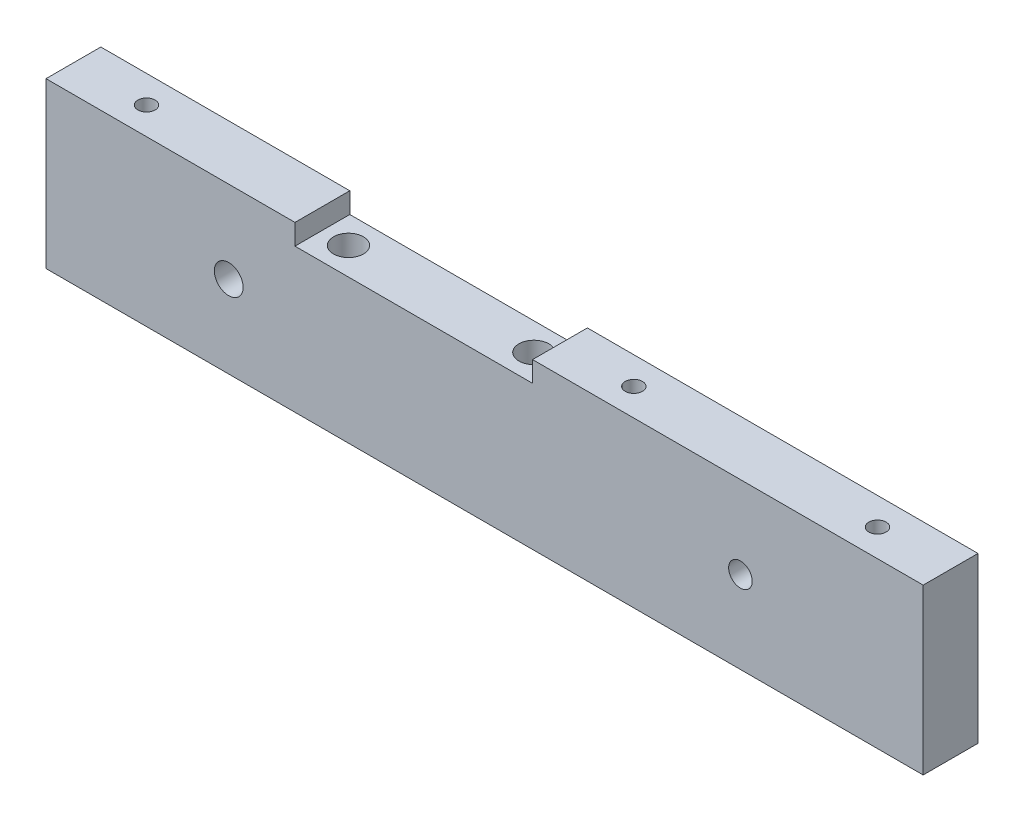
ISO-10303-21;
HEADER;
FILE_DESCRIPTION(('STEP AP214'),'2;1');
FILE_NAME('part.step','',(''),(''),'','','');
FILE_SCHEMA(('AUTOMOTIVE_DESIGN { 1 0 10303 214 1 1 1 1 }'));
ENDSEC;
DATA;
#1=APPLICATION_CONTEXT('core data for automotive mechanical design processes');
#2=APPLICATION_PROTOCOL_DEFINITION('international standard','automotive_design',2000,#1);
#3=PRODUCT_CONTEXT('',#1,'mechanical');
#4=PRODUCT('Part','Part','',(#3));
#5=PRODUCT_RELATED_PRODUCT_CATEGORY('part','',(#4));
#6=PRODUCT_DEFINITION_FORMATION('','',#4);
#7=PRODUCT_DEFINITION_CONTEXT('part definition',#1,'design');
#8=PRODUCT_DEFINITION('design','',#6,#7);
#9=PRODUCT_DEFINITION_SHAPE('','',#8);
#10=(LENGTH_UNIT() NAMED_UNIT(*) SI_UNIT(.MILLI.,.METRE.));
#11=(NAMED_UNIT(*) PLANE_ANGLE_UNIT() SI_UNIT($,.RADIAN.));
#12=(NAMED_UNIT(*) SI_UNIT($,.STERADIAN.) SOLID_ANGLE_UNIT());
#13=UNCERTAINTY_MEASURE_WITH_UNIT(LENGTH_MEASURE(1.E-05),#10,'distance_accuracy_value','');
#14=(GEOMETRIC_REPRESENTATION_CONTEXT(3) GLOBAL_UNCERTAINTY_ASSIGNED_CONTEXT((#13)) GLOBAL_UNIT_ASSIGNED_CONTEXT((#10,
#11,#12)) REPRESENTATION_CONTEXT('',''));
#15=CARTESIAN_POINT('',(0.,0.,0.));
#16=DIRECTION('',(0.,0.,1.));
#17=DIRECTION('',(1.,0.,0.));
#18=AXIS2_PLACEMENT_3D('',#15,#16,#17);
#19=CARTESIAN_POINT('',(124.396126897883,37.6103450415102,59.7256341253695));
#20=DIRECTION('',(0.,-1.,0.));
#21=DIRECTION('',(-1.,0.,0.));
#22=AXIS2_PLACEMENT_3D('',#19,#20,#21);
#23=PLANE('',#22);
#24=CARTESIAN_POINT('',(-15.303873102117,37.6103450415102,64.4881341253694));
#25=DIRECTION('',(0.,-1.,0.));
#26=DIRECTION('',(-1.,0.,0.));
#27=AXIS2_PLACEMENT_3D('',#24,#25,#26);
#28=CIRCLE('',#27,1.49999999999999);
#29=CARTESIAN_POINT('',(-16.803873102117,37.6103450415102,64.4881341253694));
#30=VERTEX_POINT('',#29);
#31=EDGE_CURVE('E59',#30,#30,#28,.T.);
#32=ORIENTED_EDGE('',*,*,#31,.T.);
#33=EDGE_LOOP('',(#32));
#34=FACE_BOUND('',#33,.T.);
#35=DIRECTION('',(0.,0.,-1.));
#36=VECTOR('',#35,1.);
#37=CARTESIAN_POINT('',(15.2511268978829,37.6103450415102,59.7256341253695));
#38=LINE('',#37,#36);
#39=CARTESIAN_POINT('',(15.2511268978829,37.6103450415102,69.2506341253694));
#40=VERTEX_POINT('',#39);
#41=CARTESIAN_POINT('',(15.2511268978829,37.6103450415102,59.7256341253695));
#42=VERTEX_POINT('',#41);
#43=EDGE_CURVE('E202',#40,#42,#38,.T.);
#44=ORIENTED_EDGE('',*,*,#43,.T.);
#45=DIRECTION('',(1.,0.,0.));
#46=VECTOR('',#45,1.);
#47=CARTESIAN_POINT('',(124.396126897883,37.6103450415102,59.7256341253695));
#48=LINE('',#47,#46);
#49=CARTESIAN_POINT('',(-28.0038731021171,37.6103450415102,59.7256341253694));
#50=VERTEX_POINT('',#49);
#51=EDGE_CURVE('E277',#50,#42,#48,.T.);
#52=ORIENTED_EDGE('',*,*,#51,.F.);
#53=DIRECTION('',(0.,0.,1.));
#54=VECTOR('',#53,1.);
#55=CARTESIAN_POINT('',(-28.0038731021171,37.6103450415102,59.7256341253694));
#56=LINE('',#55,#54);
#57=CARTESIAN_POINT('',(-28.0038731021171,37.6103450415102,69.2506341253694));
#58=VERTEX_POINT('',#57);
#59=EDGE_CURVE('E312',#50,#58,#56,.T.);
#60=ORIENTED_EDGE('',*,*,#59,.T.);
#61=DIRECTION('',(1.,0.,0.));
#62=VECTOR('',#61,1.);
#63=CARTESIAN_POINT('',(124.396126897883,37.6103450415102,69.2506341253695));
#64=LINE('',#63,#62);
#65=EDGE_CURVE('E292',#58,#40,#64,.T.);
#66=ORIENTED_EDGE('',*,*,#65,.T.);
#67=EDGE_LOOP('',(#44,#52,#60,#66));
#68=FACE_BOUND('',#67,.T.);
#69=ADVANCED_FACE('F49',(#34,#68),#23,.F.);
#70=CARTESIAN_POINT('',(111.696126897883,37.6103450415102,64.4881341253695));
#71=DIRECTION('',(0.,-1.,0.));
#72=DIRECTION('',(-1.,0.,0.));
#73=AXIS2_PLACEMENT_3D('',#70,#71,#72);
#74=CIRCLE('',#73,1.49999999999999);
#75=CARTESIAN_POINT('',(110.196126897883,37.6103450415102,64.4881341253695));
#76=VERTEX_POINT('',#75);
#77=EDGE_CURVE('E266',#76,#76,#74,.T.);
#78=ORIENTED_EDGE('',*,*,#77,.T.);
#79=EDGE_LOOP('',(#78));
#80=FACE_BOUND('',#79,.T.);
#81=CARTESIAN_POINT('',(69.3627935645496,37.6103450415102,64.4881341253695));
#82=DIRECTION('',(0.,-1.,0.));
#83=DIRECTION('',(-1.,0.,0.));
#84=AXIS2_PLACEMENT_3D('',#81,#82,#83);
#85=CIRCLE('',#84,1.49999999999999);
#86=CARTESIAN_POINT('',(67.8627935645496,37.6103450415102,64.4881341253695));
#87=VERTEX_POINT('',#86);
#88=EDGE_CURVE('E251',#87,#87,#85,.T.);
#89=ORIENTED_EDGE('',*,*,#88,.T.);
#90=EDGE_LOOP('',(#89));
#91=FACE_BOUND('',#90,.T.);
#92=DIRECTION('',(0.,0.,1.));
#93=VECTOR('',#92,1.);
#94=CARTESIAN_POINT('',(56.5311268978829,37.6103450415102,59.7256341253695));
#95=LINE('',#94,#93);
#96=CARTESIAN_POINT('',(56.5311268978829,37.6103450415102,59.7256341253695));
#97=VERTEX_POINT('',#96);
#98=CARTESIAN_POINT('',(56.5311268978829,37.6103450415102,69.2506341253695));
#99=VERTEX_POINT('',#98);
#100=EDGE_CURVE('E184',#97,#99,#95,.T.);
#101=ORIENTED_EDGE('',*,*,#100,.T.);
#102=CARTESIAN_POINT('',(124.396126897883,37.6103450415102,69.2506341253695));
#103=VERTEX_POINT('',#102);
#104=EDGE_CURVE('E291',#99,#103,#64,.T.);
#105=ORIENTED_EDGE('',*,*,#104,.T.);
#106=DIRECTION('',(0.,0.,1.));
#107=VECTOR('',#106,1.);
#108=CARTESIAN_POINT('',(124.396126897883,37.6103450415102,59.7256341253695));
#109=LINE('',#108,#107);
#110=CARTESIAN_POINT('',(124.396126897883,37.6103450415102,59.7256341253695));
#111=VERTEX_POINT('',#110);
#112=EDGE_CURVE('E308',#111,#103,#109,.T.);
#113=ORIENTED_EDGE('',*,*,#112,.F.);
#114=EDGE_CURVE('E275',#97,#111,#48,.T.);
#115=ORIENTED_EDGE('',*,*,#114,.F.);
#116=EDGE_LOOP('',(#101,#105,#113,#115));
#117=FACE_BOUND('',#116,.T.);
#118=ADVANCED_FACE('F342',(#80,#91,#117),#23,.F.);
#119=CARTESIAN_POINT('',(-28.0038731021171,9.03534504151022,59.7256341253695));
#120=DIRECTION('',(0.,0.,1.));
#121=DIRECTION('',(1.,0.,0.));
#122=AXIS2_PLACEMENT_3D('',#119,#120,#121);
#123=PLANE('',#122);
#124=CARTESIAN_POINT('',(92.646126897883,23.3228450415102,59.7256341253695));
#125=DIRECTION('',(0.,0.,-1.));
#126=DIRECTION('',(-1.,0.,0.));
#127=AXIS2_PLACEMENT_3D('',#124,#125,#126);
#128=CIRCLE('',#127,2.05);
#129=CARTESIAN_POINT('',(90.596126897883,23.3228450415102,59.7256341253695));
#130=VERTEX_POINT('',#129);
#131=EDGE_CURVE('E243',#130,#130,#128,.T.);
#132=ORIENTED_EDGE('',*,*,#131,.F.);
#133=EDGE_LOOP('',(#132));
#134=FACE_BOUND('',#133,.T.);
#135=CARTESIAN_POINT('',(3.74612689788295,23.3228450415102,59.7256341253695));
#136=DIRECTION('',(0.,0.,-1.));
#137=DIRECTION('',(-1.,0.,0.));
#138=AXIS2_PLACEMENT_3D('',#135,#136,#137);
#139=CIRCLE('',#138,10.975);
#140=CARTESIAN_POINT('',(-7.22887310211705,23.3228450415102,59.7256341253695));
#141=VERTEX_POINT('',#140);
#142=EDGE_CURVE('E238',#141,#141,#139,.T.);
#143=ORIENTED_EDGE('',*,*,#142,.F.);
#144=EDGE_LOOP('',(#143));
#145=FACE_BOUND('',#144,.T.);
#146=DIRECTION('',(0.,1.,0.));
#147=VECTOR('',#146,1.);
#148=CARTESIAN_POINT('',(15.2511268978829,-33.329310332988,59.7256341253695));
#149=LINE('',#148,#147);
#150=CARTESIAN_POINT('',(15.2511268978829,34.0353450415102,59.7256341253695));
#151=VERTEX_POINT('',#150);
#152=EDGE_CURVE('E210',#151,#42,#149,.T.);
#153=ORIENTED_EDGE('',*,*,#152,.F.);
#154=DIRECTION('',(-1.,0.,0.));
#155=VECTOR('',#154,1.);
#156=CARTESIAN_POINT('',(56.5311268978829,34.0353450415102,59.7256341253695));
#157=LINE('',#156,#155);
#158=CARTESIAN_POINT('',(56.5311268978829,34.0353450415102,59.7256341253695));
#159=VERTEX_POINT('',#158);
#160=EDGE_CURVE('E192',#159,#151,#157,.T.);
#161=ORIENTED_EDGE('',*,*,#160,.F.);
#162=DIRECTION('',(0.,1.,0.));
#163=VECTOR('',#162,1.);
#164=CARTESIAN_POINT('',(56.5311268978829,-33.329310332988,59.7256341253695));
#165=LINE('',#164,#163);
#166=EDGE_CURVE('E206',#159,#97,#165,.T.);
#167=ORIENTED_EDGE('',*,*,#166,.T.);
#168=ORIENTED_EDGE('',*,*,#114,.T.);
#169=DIRECTION('',(0.,-1.,0.));
#170=VECTOR('',#169,1.);
#171=CARTESIAN_POINT('',(124.396126897883,9.03534504151022,59.7256341253695));
#172=LINE('',#171,#170);
#173=CARTESIAN_POINT('',(124.396126897883,9.03534504151022,59.7256341253695));
#174=VERTEX_POINT('',#173);
#175=EDGE_CURVE('E281',#111,#174,#172,.T.);
#176=ORIENTED_EDGE('',*,*,#175,.T.);
#177=DIRECTION('',(-1.,0.,0.));
#178=VECTOR('',#177,1.);
#179=CARTESIAN_POINT('',(-28.0038731021171,9.03534504151022,59.7256341253695));
#180=LINE('',#179,#178);
#181=CARTESIAN_POINT('',(-28.0038731021171,9.03534504151022,59.7256341253695));
#182=VERTEX_POINT('',#181);
#183=EDGE_CURVE('E284',#174,#182,#180,.T.);
#184=ORIENTED_EDGE('',*,*,#183,.T.);
#185=DIRECTION('',(0.,1.,0.));
#186=VECTOR('',#185,1.);
#187=CARTESIAN_POINT('',(-28.0038731021171,37.6103450415102,59.7256341253694));
#188=LINE('',#187,#186);
#189=EDGE_CURVE('E271',#182,#50,#188,.T.);
#190=ORIENTED_EDGE('',*,*,#189,.T.);
#191=ORIENTED_EDGE('',*,*,#51,.T.);
#192=EDGE_LOOP('',(#153,#161,#167,#168,#176,#184,#190,#191));
#193=FACE_BOUND('',#192,.T.);
#194=ADVANCED_FACE('F349',(#134,#145,#193),#123,.F.);
#195=CARTESIAN_POINT('',(-28.0038731021171,9.03534504151023,69.2506341253695));
#196=DIRECTION('',(0.,0.,1.));
#197=DIRECTION('',(1.,0.,0.));
#198=AXIS2_PLACEMENT_3D('',#195,#196,#197);
#199=PLANE('',#198);
#200=CARTESIAN_POINT('',(3.74612689788295,23.3228450415102,69.2506341253695));
#201=DIRECTION('',(0.,0.,-1.));
#202=DIRECTION('',(-1.,0.,0.));
#203=AXIS2_PLACEMENT_3D('',#200,#201,#202);
#204=CIRCLE('',#203,2.5);
#205=CARTESIAN_POINT('',(1.24612689788295,23.3228450415102,69.2506341253695));
#206=VERTEX_POINT('',#205);
#207=EDGE_CURVE('E231',#206,#206,#204,.T.);
#208=ORIENTED_EDGE('',*,*,#207,.T.);
#209=EDGE_LOOP('',(#208));
#210=FACE_BOUND('',#209,.T.);
#211=CARTESIAN_POINT('',(92.646126897883,23.3228450415102,69.2506341253695));
#212=DIRECTION('',(0.,0.,-1.));
#213=DIRECTION('',(-1.,0.,0.));
#214=AXIS2_PLACEMENT_3D('',#211,#212,#213);
#215=CIRCLE('',#214,2.05);
#216=CARTESIAN_POINT('',(90.596126897883,23.3228450415102,69.2506341253695));
#217=VERTEX_POINT('',#216);
#218=EDGE_CURVE('E247',#217,#217,#215,.T.);
#219=ORIENTED_EDGE('',*,*,#218,.T.);
#220=EDGE_LOOP('',(#219));
#221=FACE_BOUND('',#220,.T.);
#222=DIRECTION('',(1.,0.,0.));
#223=VECTOR('',#222,1.);
#224=CARTESIAN_POINT('',(56.5311268978829,34.0353450415102,69.2506341253695));
#225=LINE('',#224,#223);
#226=CARTESIAN_POINT('',(15.2511268978829,34.0353450415102,69.2506341253694));
#227=VERTEX_POINT('',#226);
#228=CARTESIAN_POINT('',(56.5311268978829,34.0353450415102,69.2506341253695));
#229=VERTEX_POINT('',#228);
#230=EDGE_CURVE('E191',#227,#229,#225,.T.);
#231=ORIENTED_EDGE('',*,*,#230,.F.);
#232=DIRECTION('',(0.,1.,0.));
#233=VECTOR('',#232,1.);
#234=CARTESIAN_POINT('',(15.2511268978829,-33.329310332988,69.2506341253695));
#235=LINE('',#234,#233);
#236=EDGE_CURVE('E213',#227,#40,#235,.T.);
#237=ORIENTED_EDGE('',*,*,#236,.T.);
#238=ORIENTED_EDGE('',*,*,#65,.F.);
#239=DIRECTION('',(0.,1.,0.));
#240=VECTOR('',#239,1.);
#241=CARTESIAN_POINT('',(-28.0038731021171,37.6103450415102,69.2506341253694));
#242=LINE('',#241,#240);
#243=CARTESIAN_POINT('',(-28.0038731021171,9.03534504151023,69.2506341253695));
#244=VERTEX_POINT('',#243);
#245=EDGE_CURVE('E270',#244,#58,#242,.T.);
#246=ORIENTED_EDGE('',*,*,#245,.F.);
#247=DIRECTION('',(-1.,0.,0.));
#248=VECTOR('',#247,1.);
#249=CARTESIAN_POINT('',(-28.0038731021171,9.03534504151023,69.2506341253695));
#250=LINE('',#249,#248);
#251=CARTESIAN_POINT('',(124.396126897883,9.03534504151022,69.2506341253695));
#252=VERTEX_POINT('',#251);
#253=EDGE_CURVE('E276',#252,#244,#250,.T.);
#254=ORIENTED_EDGE('',*,*,#253,.F.);
#255=DIRECTION('',(0.,-1.,0.));
#256=VECTOR('',#255,1.);
#257=CARTESIAN_POINT('',(124.396126897883,9.03534504151022,69.2506341253695));
#258=LINE('',#257,#256);
#259=EDGE_CURVE('E296',#103,#252,#258,.T.);
#260=ORIENTED_EDGE('',*,*,#259,.F.);
#261=ORIENTED_EDGE('',*,*,#104,.F.);
#262=DIRECTION('',(0.,1.,0.));
#263=VECTOR('',#262,1.);
#264=CARTESIAN_POINT('',(56.5311268978829,-33.329310332988,69.2506341253695));
#265=LINE('',#264,#263);
#266=EDGE_CURVE('E217',#229,#99,#265,.T.);
#267=ORIENTED_EDGE('',*,*,#266,.F.);
#268=EDGE_LOOP('',(#231,#237,#238,#246,#254,#260,#261,#267));
#269=FACE_BOUND('',#268,.T.);
#270=ADVANCED_FACE('F337',(#210,#221,#269),#199,.T.);
#271=CARTESIAN_POINT('',(19.7861268978829,37.6103450415102,64.4881341253695));
#272=DIRECTION('',(0.,-1.,0.));
#273=DIRECTION('',(-1.,0.,0.));
#274=AXIS2_PLACEMENT_3D('',#271,#272,#273);
#275=CYLINDRICAL_SURFACE('',#274,2.6);
#276=CARTESIAN_POINT('',(19.7861268978829,9.03534504151022,64.4881341253695));
#277=DIRECTION('',(0.,-1.,0.));
#278=DIRECTION('',(-1.,0.,0.));
#279=AXIS2_PLACEMENT_3D('',#276,#277,#278);
#280=CIRCLE('',#279,2.6);
#281=CARTESIAN_POINT('',(17.1861268978829,9.03534504151022,64.4881341253695));
#282=VERTEX_POINT('',#281);
#283=EDGE_CURVE('E226',#282,#282,#280,.T.);
#284=ORIENTED_EDGE('',*,*,#283,.T.);
#285=EDGE_LOOP('',(#284));
#286=FACE_BOUND('',#285,.T.);
#287=CARTESIAN_POINT('',(19.7861268978829,34.0353450415102,64.4881341253695));
#288=DIRECTION('',(0.,1.,0.));
#289=DIRECTION('',(1.,0.,0.));
#290=AXIS2_PLACEMENT_3D('',#287,#288,#289);
#291=CIRCLE('',#290,2.6);
#292=CARTESIAN_POINT('',(22.3861268978829,34.0353450415102,64.4881341253695));
#293=VERTEX_POINT('',#292);
#294=EDGE_CURVE('E222',#293,#293,#291,.F.);
#295=ORIENTED_EDGE('',*,*,#294,.F.);
#296=EDGE_LOOP('',(#295));
#297=FACE_BOUND('',#296,.T.);
#298=ADVANCED_FACE('F327',(#286,#297),#275,.F.);
#299=CARTESIAN_POINT('',(51.9961268978829,37.6103450415102,64.4881341253695));
#300=DIRECTION('',(0.,-1.,0.));
#301=DIRECTION('',(-1.,0.,0.));
#302=AXIS2_PLACEMENT_3D('',#299,#300,#301);
#303=CYLINDRICAL_SURFACE('',#302,2.6);
#304=CARTESIAN_POINT('',(51.9961268978829,9.03534504151022,64.4881341253695));
#305=DIRECTION('',(0.,-1.,0.));
#306=DIRECTION('',(-1.,0.,0.));
#307=AXIS2_PLACEMENT_3D('',#304,#305,#306);
#308=CIRCLE('',#307,2.6);
#309=CARTESIAN_POINT('',(49.3961268978829,9.03534504151022,64.4881341253695));
#310=VERTEX_POINT('',#309);
#311=EDGE_CURVE('E227',#310,#310,#308,.T.);
#312=ORIENTED_EDGE('',*,*,#311,.T.);
#313=EDGE_LOOP('',(#312));
#314=FACE_BOUND('',#313,.T.);
#315=CARTESIAN_POINT('',(51.9961268978829,34.0353450415102,64.4881341253695));
#316=DIRECTION('',(0.,1.,0.));
#317=DIRECTION('',(1.,0.,0.));
#318=AXIS2_PLACEMENT_3D('',#315,#316,#317);
#319=CIRCLE('',#318,2.6);
#320=CARTESIAN_POINT('',(54.596126897883,34.0353450415102,64.4881341253695));
#321=VERTEX_POINT('',#320);
#322=EDGE_CURVE('E198',#321,#321,#319,.F.);
#323=ORIENTED_EDGE('',*,*,#322,.F.);
#324=EDGE_LOOP('',(#323));
#325=FACE_BOUND('',#324,.T.);
#326=ADVANCED_FACE('F325',(#314,#325),#303,.F.);
#327=CARTESIAN_POINT('',(-15.303873102117,9.03534504151022,64.4881341253695));
#328=DIRECTION('',(0.,-1.,0.));
#329=DIRECTION('',(-1.,0.,0.));
#330=AXIS2_PLACEMENT_3D('',#327,#328,#329);
#331=CYLINDRICAL_SURFACE('',#330,1.5);
#332=ORIENTED_EDGE('',*,*,#31,.F.);
#333=EDGE_LOOP('',(#332));
#334=FACE_BOUND('',#333,.T.);
#335=CARTESIAN_POINT('',(-15.303873102117,9.03534504151022,64.4881341253695));
#336=DIRECTION('',(0.,-1.,0.));
#337=DIRECTION('',(-1.,0.,0.));
#338=AXIS2_PLACEMENT_3D('',#335,#336,#337);
#339=CIRCLE('',#338,1.5);
#340=CARTESIAN_POINT('',(-16.803873102117,9.03534504151022,64.4881341253695));
#341=VERTEX_POINT('',#340);
#342=EDGE_CURVE('E12',#341,#341,#339,.T.);
#343=ORIENTED_EDGE('',*,*,#342,.T.);
#344=EDGE_LOOP('',(#343));
#345=FACE_BOUND('',#344,.T.);
#346=ADVANCED_FACE('F51',(#334,#345),#331,.F.);
#347=CARTESIAN_POINT('',(-28.0038731021171,37.6103450415102,59.7256341253694));
#348=DIRECTION('',(1.,0.,0.));
#349=DIRECTION('',(0.,-1.,0.));
#350=AXIS2_PLACEMENT_3D('',#347,#348,#349);
#351=PLANE('',#350);
#352=ORIENTED_EDGE('',*,*,#245,.T.);
#353=ORIENTED_EDGE('',*,*,#59,.F.);
#354=ORIENTED_EDGE('',*,*,#189,.F.);
#355=DIRECTION('',(0.,0.,1.));
#356=VECTOR('',#355,1.);
#357=CARTESIAN_POINT('',(-28.0038731021171,9.03534504151022,59.7256341253695));
#358=LINE('',#357,#356);
#359=EDGE_CURVE('E287',#182,#244,#358,.T.);
#360=ORIENTED_EDGE('',*,*,#359,.T.);
#361=EDGE_LOOP('',(#352,#353,#354,#360));
#362=FACE_BOUND('',#361,.T.);
#363=ADVANCED_FACE('F335',(#362),#351,.F.);
#364=CARTESIAN_POINT('',(124.396126897883,9.03534504151022,59.7256341253695));
#365=DIRECTION('',(-1.,0.,0.));
#366=DIRECTION('',(0.,1.,0.));
#367=AXIS2_PLACEMENT_3D('',#364,#365,#366);
#368=PLANE('',#367);
#369=ORIENTED_EDGE('',*,*,#259,.T.);
#370=DIRECTION('',(0.,0.,1.));
#371=VECTOR('',#370,1.);
#372=CARTESIAN_POINT('',(124.396126897883,9.03534504151022,59.7256341253695));
#373=LINE('',#372,#371);
#374=EDGE_CURVE('E304',#174,#252,#373,.T.);
#375=ORIENTED_EDGE('',*,*,#374,.F.);
#376=ORIENTED_EDGE('',*,*,#175,.F.);
#377=ORIENTED_EDGE('',*,*,#112,.T.);
#378=EDGE_LOOP('',(#369,#375,#376,#377));
#379=FACE_BOUND('',#378,.T.);
#380=ADVANCED_FACE('F353',(#379),#368,.F.);
#381=CARTESIAN_POINT('',(-28.0038731021171,9.03534504151022,59.7256341253695));
#382=DIRECTION('',(0.,1.,0.));
#383=DIRECTION('',(1.,0.,0.));
#384=AXIS2_PLACEMENT_3D('',#381,#382,#383);
#385=PLANE('',#384);
#386=ORIENTED_EDGE('',*,*,#311,.F.);
#387=EDGE_LOOP('',(#386));
#388=FACE_BOUND('',#387,.T.);
#389=ORIENTED_EDGE('',*,*,#283,.F.);
#390=EDGE_LOOP('',(#389));
#391=FACE_BOUND('',#390,.T.);
#392=CARTESIAN_POINT('',(69.3627935645496,9.03534504151022,64.4881341253695));
#393=DIRECTION('',(0.,-1.,0.));
#394=DIRECTION('',(-1.,0.,0.));
#395=AXIS2_PLACEMENT_3D('',#392,#393,#394);
#396=CIRCLE('',#395,1.5);
#397=CARTESIAN_POINT('',(67.8627935645496,9.03534504151022,64.4881341253695));
#398=VERTEX_POINT('',#397);
#399=EDGE_CURVE('E258',#398,#398,#396,.T.);
#400=ORIENTED_EDGE('',*,*,#399,.F.);
#401=EDGE_LOOP('',(#400));
#402=FACE_BOUND('',#401,.T.);
#403=CARTESIAN_POINT('',(111.696126897883,9.03534504151022,64.4881341253695));
#404=DIRECTION('',(0.,-1.,0.));
#405=DIRECTION('',(-1.,0.,0.));
#406=AXIS2_PLACEMENT_3D('',#403,#404,#405);
#407=CIRCLE('',#406,1.5);
#408=CARTESIAN_POINT('',(110.196126897883,9.03534504151022,64.4881341253695));
#409=VERTEX_POINT('',#408);
#410=EDGE_CURVE('E262',#409,#409,#407,.T.);
#411=ORIENTED_EDGE('',*,*,#410,.F.);
#412=EDGE_LOOP('',(#411));
#413=FACE_BOUND('',#412,.T.);
#414=ORIENTED_EDGE('',*,*,#253,.T.);
#415=ORIENTED_EDGE('',*,*,#359,.F.);
#416=ORIENTED_EDGE('',*,*,#183,.F.);
#417=ORIENTED_EDGE('',*,*,#374,.T.);
#418=EDGE_LOOP('',(#414,#415,#416,#417));
#419=FACE_BOUND('',#418,.T.);
#420=ORIENTED_EDGE('',*,*,#342,.F.);
#421=EDGE_LOOP('',(#420));
#422=FACE_BOUND('',#421,.T.);
#423=ADVANCED_FACE('F358',(#388,#391,#402,#413,#419,#422),#385,.F.);
#424=CARTESIAN_POINT('',(111.696126897883,9.03534504151022,64.4881341253695));
#425=DIRECTION('',(0.,-1.,0.));
#426=DIRECTION('',(-1.,0.,0.));
#427=AXIS2_PLACEMENT_3D('',#424,#425,#426);
#428=CYLINDRICAL_SURFACE('',#427,1.5);
#429=ORIENTED_EDGE('',*,*,#77,.F.);
#430=EDGE_LOOP('',(#429));
#431=FACE_BOUND('',#430,.T.);
#432=ORIENTED_EDGE('',*,*,#410,.T.);
#433=EDGE_LOOP('',(#432));
#434=FACE_BOUND('',#433,.T.);
#435=ADVANCED_FACE('F507',(#431,#434),#428,.F.);
#436=CARTESIAN_POINT('',(69.3627935645496,9.03534504151022,64.4881341253695));
#437=DIRECTION('',(0.,-1.,0.));
#438=DIRECTION('',(-1.,0.,0.));
#439=AXIS2_PLACEMENT_3D('',#436,#437,#438);
#440=CYLINDRICAL_SURFACE('',#439,1.5);
#441=ORIENTED_EDGE('',*,*,#88,.F.);
#442=EDGE_LOOP('',(#441));
#443=FACE_BOUND('',#442,.T.);
#444=ORIENTED_EDGE('',*,*,#399,.T.);
#445=EDGE_LOOP('',(#444));
#446=FACE_BOUND('',#445,.T.);
#447=ADVANCED_FACE('F502',(#443,#446),#440,.F.);
#448=CARTESIAN_POINT('',(92.646126897883,23.3228450415102,69.2506341253695));
#449=DIRECTION('',(0.,0.,-1.));
#450=DIRECTION('',(-1.,0.,0.));
#451=AXIS2_PLACEMENT_3D('',#448,#449,#450);
#452=CYLINDRICAL_SURFACE('',#451,2.05);
#453=CARTESIAN_POINT('',(90.596126897883,23.3228450415102,69.2506341253695));
#454=CARTESIAN_POINT('',(90.596126897883,23.3228450415102,69.1514153753695));
#455=CARTESIAN_POINT('',(90.596126897883,23.3228450415102,69.0521966253695));
#456=CARTESIAN_POINT('',(90.596126897883,23.3228450415102,68.8537591253695));
#457=CARTESIAN_POINT('',(90.596126897883,23.3228450415102,68.7545403753695));
#458=CARTESIAN_POINT('',(90.596126897883,23.3228450415102,68.5561028753695));
#459=CARTESIAN_POINT('',(90.596126897883,23.3228450415102,68.4568841253695));
#460=CARTESIAN_POINT('',(90.596126897883,23.3228450415102,68.2584466253695));
#461=CARTESIAN_POINT('',(90.596126897883,23.3228450415102,68.1592278753695));
#462=CARTESIAN_POINT('',(90.596126897883,23.3228450415102,67.9607903753695));
#463=CARTESIAN_POINT('',(90.596126897883,23.3228450415102,67.8615716253695));
#464=CARTESIAN_POINT('',(90.596126897883,23.3228450415102,67.6631341253695));
#465=CARTESIAN_POINT('',(90.596126897883,23.3228450415102,67.5639153753695));
#466=CARTESIAN_POINT('',(90.596126897883,23.3228450415102,67.3654778753695));
#467=CARTESIAN_POINT('',(90.596126897883,23.3228450415102,67.2662591253695));
#468=CARTESIAN_POINT('',(90.596126897883,23.3228450415102,67.0678216253695));
#469=CARTESIAN_POINT('',(90.596126897883,23.3228450415102,66.9686028753695));
#470=CARTESIAN_POINT('',(90.596126897883,23.3228450415102,66.7701653753695));
#471=CARTESIAN_POINT('',(90.596126897883,23.3228450415102,66.6709466253695));
#472=CARTESIAN_POINT('',(90.596126897883,23.3228450415102,66.4725091253695));
#473=CARTESIAN_POINT('',(90.596126897883,23.3228450415102,66.3732903753695));
#474=CARTESIAN_POINT('',(90.596126897883,23.3228450415102,66.1748528753695));
#475=CARTESIAN_POINT('',(90.596126897883,23.3228450415102,66.0756341253695));
#476=CARTESIAN_POINT('',(90.596126897883,23.3228450415102,65.8771966253695));
#477=CARTESIAN_POINT('',(90.596126897883,23.3228450415102,65.7779778753695));
#478=CARTESIAN_POINT('',(90.596126897883,23.3228450415102,65.5795403753695));
#479=CARTESIAN_POINT('',(90.596126897883,23.3228450415102,65.4803216253695));
#480=CARTESIAN_POINT('',(90.596126897883,23.3228450415102,65.2818841253695));
#481=CARTESIAN_POINT('',(90.596126897883,23.3228450415102,65.1826653753695));
#482=CARTESIAN_POINT('',(90.596126897883,23.3228450415102,64.9842278753695));
#483=CARTESIAN_POINT('',(90.596126897883,23.3228450415102,64.8850091253695));
#484=CARTESIAN_POINT('',(90.596126897883,23.3228450415102,64.6865716253695));
#485=CARTESIAN_POINT('',(90.596126897883,23.3228450415102,64.5873528753695));
#486=CARTESIAN_POINT('',(90.596126897883,23.3228450415102,64.3889153753695));
#487=CARTESIAN_POINT('',(90.596126897883,23.3228450415102,64.2896966253695));
#488=CARTESIAN_POINT('',(90.596126897883,23.3228450415102,64.0912591253695));
#489=CARTESIAN_POINT('',(90.596126897883,23.3228450415102,63.9920403753695));
#490=CARTESIAN_POINT('',(90.596126897883,23.3228450415102,63.7936028753695));
#491=CARTESIAN_POINT('',(90.596126897883,23.3228450415102,63.6943841253695));
#492=CARTESIAN_POINT('',(90.596126897883,23.3228450415102,63.4959466253695));
#493=CARTESIAN_POINT('',(90.596126897883,23.3228450415102,63.3967278753695));
#494=CARTESIAN_POINT('',(90.596126897883,23.3228450415102,63.1982903753695));
#495=CARTESIAN_POINT('',(90.596126897883,23.3228450415102,63.0990716253695));
#496=CARTESIAN_POINT('',(90.596126897883,23.3228450415102,62.9006341253695));
#497=CARTESIAN_POINT('',(90.596126897883,23.3228450415102,62.8014153753695));
#498=CARTESIAN_POINT('',(90.596126897883,23.3228450415102,62.6029778753695));
#499=CARTESIAN_POINT('',(90.596126897883,23.3228450415102,62.5037591253695));
#500=CARTESIAN_POINT('',(90.596126897883,23.3228450415102,62.3053216253695));
#501=CARTESIAN_POINT('',(90.596126897883,23.3228450415102,62.2061028753695));
#502=CARTESIAN_POINT('',(90.596126897883,23.3228450415102,62.0076653753695));
#503=CARTESIAN_POINT('',(90.596126897883,23.3228450415102,61.9084466253695));
#504=CARTESIAN_POINT('',(90.596126897883,23.3228450415102,61.7100091253695));
#505=CARTESIAN_POINT('',(90.596126897883,23.3228450415102,61.6107903753695));
#506=CARTESIAN_POINT('',(90.596126897883,23.3228450415102,61.4123528753695));
#507=CARTESIAN_POINT('',(90.596126897883,23.3228450415102,61.3131341253695));
#508=CARTESIAN_POINT('',(90.596126897883,23.3228450415102,61.1146966253695));
#509=CARTESIAN_POINT('',(90.596126897883,23.3228450415102,61.0154778753695));
#510=CARTESIAN_POINT('',(90.596126897883,23.3228450415102,60.8170403753695));
#511=CARTESIAN_POINT('',(90.596126897883,23.3228450415102,60.7178216253695));
#512=CARTESIAN_POINT('',(90.596126897883,23.3228450415102,60.5193841253695));
#513=CARTESIAN_POINT('',(90.596126897883,23.3228450415102,60.4201653753695));
#514=CARTESIAN_POINT('',(90.596126897883,23.3228450415102,60.2217278753695));
#515=CARTESIAN_POINT('',(90.596126897883,23.3228450415102,60.1225091253695));
#516=CARTESIAN_POINT('',(90.596126897883,23.3228450415102,59.9240716253695));
#517=CARTESIAN_POINT('',(90.596126897883,23.3228450415102,59.8248528753695));
#518=CARTESIAN_POINT('',(90.596126897883,23.3228450415102,59.7256341253695));
#519=B_SPLINE_CURVE_WITH_KNOTS('',3,(#453,#454,#455,#456,#457,#458,#459,#460,#461,#462,#463,
#464,#465,#466,#467,#468,#469,#470,#471,#472,#473,#474,#475,#476,#477,#478,#479,#480,#481,#482,
#483,#484,#485,#486,#487,#488,#489,#490,#491,#492,#493,#494,#495,#496,#497,#498,#499,#500,#501,
#502,#503,#504,#505,#506,#507,#508,#509,#510,#511,#512,#513,#514,#515,#516,#517,#518),
.UNSPECIFIED.,.F.,.F.,(4,2,2,2,2,2,2,2,2,2,2,2,2,2,2,2,2,2,2,2,2,2,2,2,2,2,2,2,2,2,2,2,4),(0.,
0.297656249999986,0.595312499999986,0.892968749999987,1.19062499999999,1.48828124999999,
1.78593749999999,2.08359374999999,2.38124999999999,2.67890624999999,2.97656249999999,
3.27421874999999,3.57187499999999,3.86953124999999,4.16718749999999,4.46484374999999,
4.76249999999999,5.06015624999999,5.35781249999999,5.65546874999999,5.95312499999999,
6.25078124999999,6.54843749999999,6.84609374999999,7.14374999999999,7.44140624999999,
7.73906249999999,8.03671874999999,8.33437499999999,8.63203124999999,8.92968749999998,
9.22734374999999,9.52499999999998),.UNSPECIFIED.);
#520=EDGE_CURVE('BSEAM506',#217,#130,#519,.T.);
#521=ORIENTED_EDGE('',*,*,#218,.F.);
#522=ORIENTED_EDGE('',*,*,#131,.T.);
#523=ORIENTED_EDGE('',*,*,#520,.T.);
#524=ORIENTED_EDGE('',*,*,#520,.F.);
#525=EDGE_LOOP('',(#521,#523,#522,#524));
#526=FACE_BOUND('',#525,.T.);
#527=ADVANCED_FACE('F506',(#526),#452,.F.);
#528=CARTESIAN_POINT('',(3.74612689788295,23.3228450415102,63.7256341253695));
#529=DIRECTION('',(0.,0.,-1.));
#530=DIRECTION('',(-1.,0.,0.));
#531=AXIS2_PLACEMENT_3D('',#528,#529,#530);
#532=CYLINDRICAL_SURFACE('',#531,10.975);
#533=CARTESIAN_POINT('',(3.74612689788295,23.3228450415102,63.7256341253695));
#534=DIRECTION('',(0.,0.,-1.));
#535=DIRECTION('',(-1.,0.,0.));
#536=AXIS2_PLACEMENT_3D('',#533,#534,#535);
#537=CIRCLE('',#536,10.975);
#538=CARTESIAN_POINT('',(-7.22887310211705,23.3228450415102,63.7256341253695));
#539=VERTEX_POINT('',#538);
#540=EDGE_CURVE('E239',#539,#539,#537,.T.);
#541=ORIENTED_EDGE('',*,*,#540,.F.);
#542=EDGE_LOOP('',(#541));
#543=FACE_BOUND('',#542,.T.);
#544=ORIENTED_EDGE('',*,*,#142,.T.);
#545=EDGE_LOOP('',(#544));
#546=FACE_BOUND('',#545,.T.);
#547=ADVANCED_FACE('F517',(#543,#546),#532,.F.);
#548=CARTESIAN_POINT('',(3.74612689788295,23.3228450415102,63.7256341253695));
#549=DIRECTION('',(0.,0.,-1.));
#550=DIRECTION('',(-1.,0.,0.));
#551=AXIS2_PLACEMENT_3D('',#548,#549,#550);
#552=PLANE('',#551);
#553=CARTESIAN_POINT('',(3.74612689788244,23.3228450415107,63.7256341253695));
#554=DIRECTION('',(0.,0.,1.));
#555=DIRECTION('',(0.,-1.,0.));
#556=AXIS2_PLACEMENT_3D('',#553,#554,#555);
#557=CIRCLE('',#556,7.05000000000037);
#558=CARTESIAN_POINT('',(2.08227128391115,16.4719995100554,63.7256341253695));
#559=VERTEX_POINT('',#558);
#560=CARTESIAN_POINT('',(10.5969724293378,24.986700655482,63.7256341253695));
#561=VERTEX_POINT('',#560);
#562=EDGE_CURVE('E173',#559,#561,#557,.T.);
#563=ORIENTED_EDGE('',*,*,#562,.T.);
#564=DIRECTION('',(-0.70424609220261,0.709955943434065,0.));
#565=VECTOR('',#564,1.);
#566=CARTESIAN_POINT('',(10.5969724293378,24.986700655482,63.7256341253695));
#567=LINE('',#566,#565);
#568=CARTESIAN_POINT('',(5.50420229039073,30.1207617013597,63.7256341253695));
#569=VERTEX_POINT('',#568);
#570=EDGE_CURVE('E67',#561,#569,#567,.T.);
#571=ORIENTED_EDGE('',*,*,#570,.T.);
#572=CARTESIAN_POINT('',(3.72360911328465,23.3226019660952,63.7256341253695));
#573=DIRECTION('',(0.,0.,1.));
#574=DIRECTION('',(0.,-1.,0.));
#575=AXIS2_PLACEMENT_3D('',#572,#573,#574);
#576=CIRCLE('',#575,7.02748090346233);
#577=CARTESIAN_POINT('',(-3.10044007129684,21.6439594863097,63.7256341253695));
#578=VERTEX_POINT('',#577);
#579=EDGE_CURVE('E177',#569,#578,#576,.T.);
#580=ORIENTED_EDGE('',*,*,#579,.T.);
#581=CARTESIAN_POINT('',(-2.91039067333845,21.7061773251248,63.7256341253695));
#582=DIRECTION('',(0.,0.,1.));
#583=DIRECTION('',(0.,-1.,0.));
#584=AXIS2_PLACEMENT_3D('',#581,#582,#583);
#585=CIRCLE('',#584,0.199974581212627);
#586=CARTESIAN_POINT('',(-3.0517897619665,21.5647696490024,63.7256341253695));
#587=VERTEX_POINT('',#586);
#588=EDGE_CURVE('E643',#578,#587,#585,.T.);
#589=ORIENTED_EDGE('',*,*,#588,.T.);
#590=DIRECTION('',(0.707128252325196,-0.707085309395913,0.));
#591=VECTOR('',#590,1.);
#592=CARTESIAN_POINT('',(-3.0517897619665,21.5647696490024,63.7256341253695));
#593=LINE('',#592,#591);
#594=CARTESIAN_POINT('',(1.99478639413294,16.518499964554,63.7256341253695));
#595=VERTEX_POINT('',#594);
#596=EDGE_CURVE('E626',#587,#595,#593,.T.);
#597=ORIENTED_EDGE('',*,*,#596,.T.);
#598=CARTESIAN_POINT('',(2.12947286161245,16.666349737898,63.7256341253695));
#599=DIRECTION('',(0.,0.,1.));
#600=DIRECTION('',(0.,-1.,0.));
#601=AXIS2_PLACEMENT_3D('',#598,#599,#600);
#602=CIRCLE('',#601,0.199999999999948);
#603=EDGE_CURVE('E621',#595,#559,#602,.T.);
#604=ORIENTED_EDGE('',*,*,#603,.T.);
#605=EDGE_LOOP('',(#563,#571,#580,#589,#597,#604));
#606=FACE_BOUND('',#605,.T.);
#607=ORIENTED_EDGE('',*,*,#540,.T.);
#608=EDGE_LOOP('',(#607));
#609=FACE_BOUND('',#608,.T.);
#610=ADVANCED_FACE('F397',(#606,#609),#552,.T.);
#611=CARTESIAN_POINT('',(3.74612689788295,23.3228450415102,69.2506341253695));
#612=DIRECTION('',(0.,0.,-1.));
#613=DIRECTION('',(-1.,0.,0.));
#614=AXIS2_PLACEMENT_3D('',#611,#612,#613);
#615=CYLINDRICAL_SURFACE('',#614,2.5);
#616=CARTESIAN_POINT('',(3.74612689788295,23.3228450415102,65.5256341253695));
#617=DIRECTION('',(0.,0.,1.));
#618=DIRECTION('',(0.,-1.,0.));
#619=AXIS2_PLACEMENT_3D('',#616,#617,#618);
#620=CIRCLE('',#619,2.5);
#621=CARTESIAN_POINT('',(3.74612689788295,20.8228450415102,65.5256341253695));
#622=VERTEX_POINT('',#621);
#623=EDGE_CURVE('E53',#622,#622,#620,.F.);
#624=ORIENTED_EDGE('',*,*,#623,.T.);
#625=EDGE_LOOP('',(#624));
#626=FACE_BOUND('',#625,.T.);
#627=ORIENTED_EDGE('',*,*,#207,.F.);
#628=EDGE_LOOP('',(#627));
#629=FACE_BOUND('',#628,.T.);
#630=ADVANCED_FACE('F388',(#626,#629),#615,.F.);
#631=CARTESIAN_POINT('',(-28.0038731021171,34.0353450415102,59.7256341253694));
#632=DIRECTION('',(0.,1.,0.));
#633=DIRECTION('',(1.,0.,0.));
#634=AXIS2_PLACEMENT_3D('',#631,#632,#633);
#635=PLANE('',#634);
#636=ORIENTED_EDGE('',*,*,#230,.T.);
#637=DIRECTION('',(0.,0.,-1.));
#638=VECTOR('',#637,1.);
#639=CARTESIAN_POINT('',(56.5311268978829,34.0353450415102,59.7256341253695));
#640=LINE('',#639,#638);
#641=EDGE_CURVE('E195',#229,#159,#640,.T.);
#642=ORIENTED_EDGE('',*,*,#641,.T.);
#643=ORIENTED_EDGE('',*,*,#160,.T.);
#644=DIRECTION('',(0.,0.,1.));
#645=VECTOR('',#644,1.);
#646=CARTESIAN_POINT('',(15.2511268978829,34.0353450415102,59.7256341253695));
#647=LINE('',#646,#645);
#648=EDGE_CURVE('E75',#151,#227,#647,.T.);
#649=ORIENTED_EDGE('',*,*,#648,.T.);
#650=EDGE_LOOP('',(#636,#642,#643,#649));
#651=FACE_BOUND('',#650,.T.);
#652=ORIENTED_EDGE('',*,*,#322,.T.);
#653=EDGE_LOOP('',(#652));
#654=FACE_BOUND('',#653,.T.);
#655=ORIENTED_EDGE('',*,*,#294,.T.);
#656=EDGE_LOOP('',(#655));
#657=FACE_BOUND('',#656,.T.);
#658=ADVANCED_FACE('F322',(#651,#654,#657),#635,.T.);
#659=CARTESIAN_POINT('',(15.2511268978829,-33.329310332988,59.7256341253695));
#660=DIRECTION('',(1.,0.,0.));
#661=DIRECTION('',(0.,0.,-1.));
#662=AXIS2_PLACEMENT_3D('',#659,#660,#661);
#663=PLANE('',#662);
#664=ORIENTED_EDGE('',*,*,#152,.T.);
#665=ORIENTED_EDGE('',*,*,#43,.F.);
#666=ORIENTED_EDGE('',*,*,#236,.F.);
#667=ORIENTED_EDGE('',*,*,#648,.F.);
#668=EDGE_LOOP('',(#664,#665,#666,#667));
#669=FACE_BOUND('',#668,.T.);
#670=ADVANCED_FACE('F387',(#669),#663,.T.);
#671=CARTESIAN_POINT('',(56.5311268978829,-33.329310332988,59.7256341253695));
#672=DIRECTION('',(-1.,0.,0.));
#673=DIRECTION('',(0.,1.,0.));
#674=AXIS2_PLACEMENT_3D('',#671,#672,#673);
#675=PLANE('',#674);
#676=ORIENTED_EDGE('',*,*,#266,.T.);
#677=ORIENTED_EDGE('',*,*,#100,.F.);
#678=ORIENTED_EDGE('',*,*,#166,.F.);
#679=ORIENTED_EDGE('',*,*,#641,.F.);
#680=EDGE_LOOP('',(#676,#677,#678,#679));
#681=FACE_BOUND('',#680,.T.);
#682=ADVANCED_FACE('F385',(#681),#675,.T.);
#683=CARTESIAN_POINT('',(3.72360911328465,23.3226019660952,65.5256341253695));
#684=DIRECTION('',(0.,0.,1.));
#685=DIRECTION('',(0.,-1.,0.));
#686=AXIS2_PLACEMENT_3D('',#683,#684,#685);
#687=PLANE('',#686);
#688=DIRECTION('',(-0.70424609220261,0.709955943434065,0.));
#689=VECTOR('',#688,1.);
#690=CARTESIAN_POINT('',(10.5969724293378,24.986700655482,65.5256341253695));
#691=LINE('',#690,#689);
#692=CARTESIAN_POINT('',(10.5969724293378,24.986700655482,65.5256341253695));
#693=VERTEX_POINT('',#692);
#694=CARTESIAN_POINT('',(5.50420229039073,30.1207617013597,65.5256341253695));
#695=VERTEX_POINT('',#694);
#696=EDGE_CURVE('E161',#693,#695,#691,.T.);
#697=ORIENTED_EDGE('',*,*,#696,.F.);
#698=CARTESIAN_POINT('',(3.74612689788244,23.3228450415107,65.5256341253695));
#699=DIRECTION('',(0.,0.,1.));
#700=DIRECTION('',(0.,-1.,0.));
#701=AXIS2_PLACEMENT_3D('',#698,#699,#700);
#702=CIRCLE('',#701,7.05000000000037);
#703=CARTESIAN_POINT('',(2.08227128391115,16.4719995100554,65.5256341253695));
#704=VERTEX_POINT('',#703);
#705=EDGE_CURVE('E633',#704,#693,#702,.T.);
#706=ORIENTED_EDGE('',*,*,#705,.F.);
#707=CARTESIAN_POINT('',(2.12947286161245,16.666349737898,65.5256341253695));
#708=DIRECTION('',(0.,0.,1.));
#709=DIRECTION('',(0.,-1.,0.));
#710=AXIS2_PLACEMENT_3D('',#707,#708,#709);
#711=CIRCLE('',#710,0.199999999999948);
#712=CARTESIAN_POINT('',(1.99478639413294,16.518499964554,65.5256341253695));
#713=VERTEX_POINT('',#712);
#714=EDGE_CURVE('E655',#713,#704,#711,.T.);
#715=ORIENTED_EDGE('',*,*,#714,.F.);
#716=DIRECTION('',(0.707128252325196,-0.707085309395913,0.));
#717=VECTOR('',#716,1.);
#718=CARTESIAN_POINT('',(-3.0517897619665,21.5647696490024,65.5256341253695));
#719=LINE('',#718,#717);
#720=CARTESIAN_POINT('',(-3.0517897619665,21.5647696490024,65.5256341253695));
#721=VERTEX_POINT('',#720);
#722=EDGE_CURVE('E658',#721,#713,#719,.T.);
#723=ORIENTED_EDGE('',*,*,#722,.F.);
#724=CARTESIAN_POINT('',(-2.91039067333845,21.7061773251248,65.5256341253695));
#725=DIRECTION('',(0.,0.,1.));
#726=DIRECTION('',(0.,-1.,0.));
#727=AXIS2_PLACEMENT_3D('',#724,#725,#726);
#728=CIRCLE('',#727,0.199974581212627);
#729=CARTESIAN_POINT('',(-3.10044007129684,21.6439594863097,65.5256341253695));
#730=VERTEX_POINT('',#729);
#731=EDGE_CURVE('E163',#730,#721,#728,.T.);
#732=ORIENTED_EDGE('',*,*,#731,.F.);
#733=CARTESIAN_POINT('',(3.72360911328465,23.3226019660952,65.5256341253695));
#734=DIRECTION('',(0.,0.,1.));
#735=DIRECTION('',(0.,-1.,0.));
#736=AXIS2_PLACEMENT_3D('',#733,#734,#735);
#737=CIRCLE('',#736,7.02748090346233);
#738=EDGE_CURVE('E156',#695,#730,#737,.T.);
#739=ORIENTED_EDGE('',*,*,#738,.F.);
#740=EDGE_LOOP('',(#697,#706,#715,#723,#732,#739));
#741=FACE_BOUND('',#740,.T.);
#742=ORIENTED_EDGE('',*,*,#623,.F.);
#743=EDGE_LOOP('',(#742));
#744=FACE_BOUND('',#743,.T.);
#745=ADVANCED_FACE('F158',(#741,#744),#687,.F.);
#746=CARTESIAN_POINT('',(10.5969724293378,24.986700655482,65.5256341253695));
#747=DIRECTION('',(-0.709955943434065,-0.70424609220261,0.));
#748=DIRECTION('',(0.70424609220261,-0.709955943434065,0.));
#749=AXIS2_PLACEMENT_3D('',#746,#747,#748);
#750=PLANE('',#749);
#751=ORIENTED_EDGE('',*,*,#570,.F.);
#752=DIRECTION('',(0.,0.,-1.));
#753=VECTOR('',#752,1.);
#754=CARTESIAN_POINT('',(10.5969724293378,24.986700655482,65.5256341253695));
#755=LINE('',#754,#753);
#756=EDGE_CURVE('E171',#693,#561,#755,.T.);
#757=ORIENTED_EDGE('',*,*,#756,.F.);
#758=ORIENTED_EDGE('',*,*,#696,.T.);
#759=DIRECTION('',(0.,0.,-1.));
#760=VECTOR('',#759,1.);
#761=CARTESIAN_POINT('',(5.50420229039073,30.1207617013597,65.5256341253695));
#762=LINE('',#761,#760);
#763=EDGE_CURVE('E170',#695,#569,#762,.T.);
#764=ORIENTED_EDGE('',*,*,#763,.T.);
#765=EDGE_LOOP('',(#751,#757,#758,#764));
#766=FACE_BOUND('',#765,.T.);
#767=ADVANCED_FACE('F169',(#766),#750,.T.);
#768=CARTESIAN_POINT('',(3.72360911328465,23.3226019660952,65.5256341253695));
#769=DIRECTION('',(0.,0.,-1.));
#770=DIRECTION('',(0.,1.,0.));
#771=AXIS2_PLACEMENT_3D('',#768,#769,#770);
#772=CYLINDRICAL_SURFACE('',#771,7.02748090346233);
#773=ORIENTED_EDGE('',*,*,#579,.F.);
#774=ORIENTED_EDGE('',*,*,#763,.F.);
#775=ORIENTED_EDGE('',*,*,#738,.T.);
#776=DIRECTION('',(0.,0.,-1.));
#777=VECTOR('',#776,1.);
#778=CARTESIAN_POINT('',(-3.10044007129684,21.6439594863097,65.5256341253695));
#779=LINE('',#778,#777);
#780=EDGE_CURVE('E179',#730,#578,#779,.T.);
#781=ORIENTED_EDGE('',*,*,#780,.T.);
#782=EDGE_LOOP('',(#773,#774,#775,#781));
#783=FACE_BOUND('',#782,.T.);
#784=ADVANCED_FACE('F175',(#783),#772,.F.);
#785=CARTESIAN_POINT('',(-2.91039067333845,21.7061773251248,65.5256341253695));
#786=DIRECTION('',(0.,0.,-1.));
#787=DIRECTION('',(0.,1.,0.));
#788=AXIS2_PLACEMENT_3D('',#785,#786,#787);
#789=CYLINDRICAL_SURFACE('',#788,0.199974581212627);
#790=ORIENTED_EDGE('',*,*,#588,.F.);
#791=ORIENTED_EDGE('',*,*,#780,.F.);
#792=ORIENTED_EDGE('',*,*,#731,.T.);
#793=DIRECTION('',(0.,0.,-1.));
#794=VECTOR('',#793,1.);
#795=CARTESIAN_POINT('',(-3.0517897619665,21.5647696490024,65.5256341253695));
#796=LINE('',#795,#794);
#797=EDGE_CURVE('E185',#721,#587,#796,.T.);
#798=ORIENTED_EDGE('',*,*,#797,.T.);
#799=EDGE_LOOP('',(#790,#791,#792,#798));
#800=FACE_BOUND('',#799,.T.);
#801=ADVANCED_FACE('F423',(#800),#789,.F.);
#802=CARTESIAN_POINT('',(-3.0517897619665,21.5647696490024,65.5256341253695));
#803=DIRECTION('',(0.707085309395913,0.707128252325196,0.));
#804=DIRECTION('',(-0.707128252325196,0.707085309395913,0.));
#805=AXIS2_PLACEMENT_3D('',#802,#803,#804);
#806=PLANE('',#805);
#807=ORIENTED_EDGE('',*,*,#596,.F.);
#808=ORIENTED_EDGE('',*,*,#797,.F.);
#809=ORIENTED_EDGE('',*,*,#722,.T.);
#810=DIRECTION('',(0.,0.,-1.));
#811=VECTOR('',#810,1.);
#812=CARTESIAN_POINT('',(1.99478639413294,16.518499964554,65.5256341253695));
#813=LINE('',#812,#811);
#814=EDGE_CURVE('E636',#713,#595,#813,.T.);
#815=ORIENTED_EDGE('',*,*,#814,.T.);
#816=EDGE_LOOP('',(#807,#808,#809,#815));
#817=FACE_BOUND('',#816,.T.);
#818=ADVANCED_FACE('F419',(#817),#806,.T.);
#819=CARTESIAN_POINT('',(2.12947286161245,16.666349737898,65.5256341253695));
#820=DIRECTION('',(0.,0.,-1.));
#821=DIRECTION('',(0.,1.,0.));
#822=AXIS2_PLACEMENT_3D('',#819,#820,#821);
#823=CYLINDRICAL_SURFACE('',#822,0.199999999999948);
#824=ORIENTED_EDGE('',*,*,#603,.F.);
#825=ORIENTED_EDGE('',*,*,#814,.F.);
#826=ORIENTED_EDGE('',*,*,#714,.T.);
#827=DIRECTION('',(0.,0.,-1.));
#828=VECTOR('',#827,1.);
#829=CARTESIAN_POINT('',(2.08227128391115,16.4719995100554,65.5256341253695));
#830=LINE('',#829,#828);
#831=EDGE_CURVE('E632',#704,#559,#830,.T.);
#832=ORIENTED_EDGE('',*,*,#831,.T.);
#833=EDGE_LOOP('',(#824,#825,#826,#832));
#834=FACE_BOUND('',#833,.T.);
#835=ADVANCED_FACE('F415',(#834),#823,.F.);
#836=CARTESIAN_POINT('',(3.74612689788244,23.3228450415107,65.5256341253695));
#837=DIRECTION('',(0.,0.,-1.));
#838=DIRECTION('',(0.,1.,0.));
#839=AXIS2_PLACEMENT_3D('',#836,#837,#838);
#840=CYLINDRICAL_SURFACE('',#839,7.05000000000037);
#841=ORIENTED_EDGE('',*,*,#562,.F.);
#842=ORIENTED_EDGE('',*,*,#831,.F.);
#843=ORIENTED_EDGE('',*,*,#705,.T.);
#844=ORIENTED_EDGE('',*,*,#756,.T.);
#845=EDGE_LOOP('',(#841,#842,#843,#844));
#846=FACE_BOUND('',#845,.T.);
#847=ADVANCED_FACE('F412',(#846),#840,.F.);
#848=CLOSED_SHELL('',(#69,#118,#194,#270,#298,#326,#346,#363,#380,#423,#435,#447,#527,#547,#610,
#630,#658,#670,#682,#745,#767,#784,#801,#818,#835,#847));
#849=MANIFOLD_SOLID_BREP('B2',#848);
#850=ADVANCED_BREP_SHAPE_REPRESENTATION('',(#18,#849),#14);
#851=SHAPE_DEFINITION_REPRESENTATION(#9,#850);
ENDSEC;
END-ISO-10303-21;
